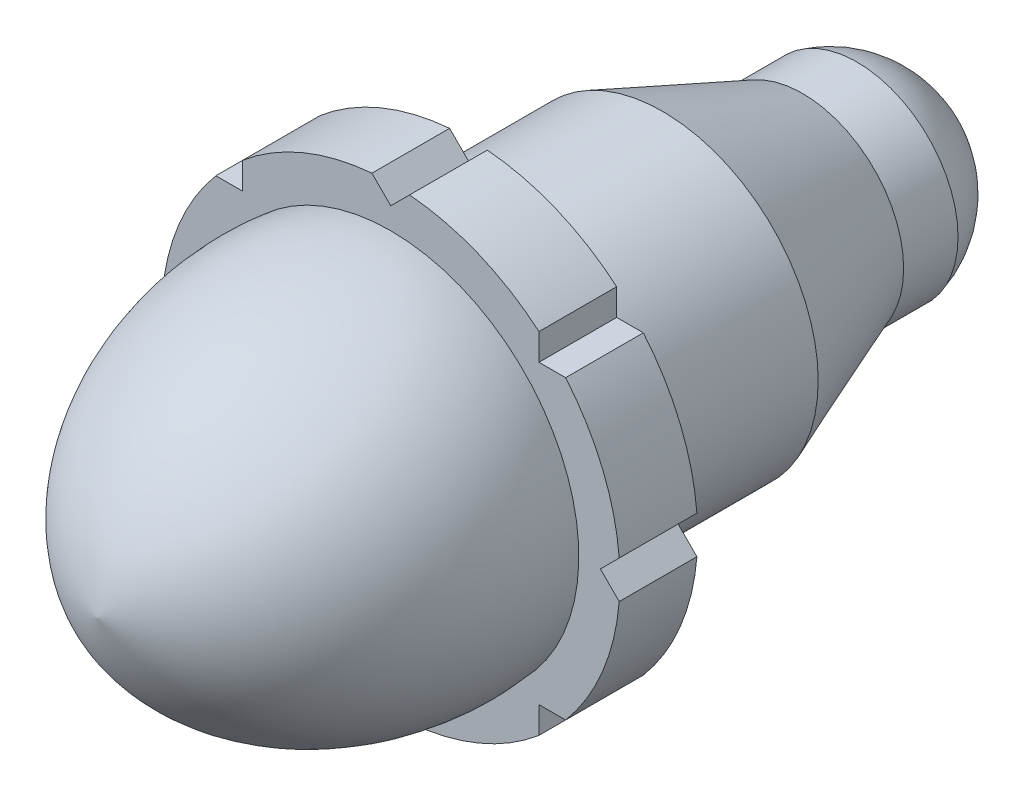
ISO-10303-21;
HEADER;
FILE_DESCRIPTION(('STEP AP214'),'2;1');
FILE_NAME('part.step','',(''),(''),'','','');
FILE_SCHEMA(('AUTOMOTIVE_DESIGN { 1 0 10303 214 1 1 1 1 }'));
ENDSEC;
DATA;
#1=APPLICATION_CONTEXT('core data for automotive mechanical design processes');
#2=APPLICATION_PROTOCOL_DEFINITION('international standard','automotive_design',2000,#1);
#3=PRODUCT_CONTEXT('',#1,'mechanical');
#4=PRODUCT('Part','Part','',(#3));
#5=PRODUCT_RELATED_PRODUCT_CATEGORY('part','',(#4));
#6=PRODUCT_DEFINITION_FORMATION('','',#4);
#7=PRODUCT_DEFINITION_CONTEXT('part definition',#1,'design');
#8=PRODUCT_DEFINITION('design','',#6,#7);
#9=PRODUCT_DEFINITION_SHAPE('','',#8);
#10=(LENGTH_UNIT() NAMED_UNIT(*) SI_UNIT(.MILLI.,.METRE.));
#11=(NAMED_UNIT(*) PLANE_ANGLE_UNIT() SI_UNIT($,.RADIAN.));
#12=(NAMED_UNIT(*) SI_UNIT($,.STERADIAN.) SOLID_ANGLE_UNIT());
#13=UNCERTAINTY_MEASURE_WITH_UNIT(LENGTH_MEASURE(1.E-05),#10,'distance_accuracy_value','');
#14=(GEOMETRIC_REPRESENTATION_CONTEXT(3) GLOBAL_UNCERTAINTY_ASSIGNED_CONTEXT((#13)) GLOBAL_UNIT_ASSIGNED_CONTEXT((#10,
#11,#12)) REPRESENTATION_CONTEXT('',''));
#15=CARTESIAN_POINT('',(0.,0.,0.));
#16=DIRECTION('',(0.,0.,1.));
#17=DIRECTION('',(1.,0.,0.));
#18=AXIS2_PLACEMENT_3D('',#15,#16,#17);
#19=CARTESIAN_POINT('',(0.,0.,7.65246356793072));
#20=DIRECTION('',(0.,0.,1.));
#21=DIRECTION('',(1.,0.,0.));
#22=AXIS2_PLACEMENT_3D('',#19,#20,#21);
#23=CYLINDRICAL_SURFACE('',#22,7.493);
#24=CARTESIAN_POINT('',(0.,0.,10.6555800844823));
#25=DIRECTION('',(0.,0.,1.));
#26=DIRECTION('',(1.,0.,0.));
#27=AXIS2_PLACEMENT_3D('',#24,#25,#26);
#28=CIRCLE('',#27,7.493);
#29=CARTESIAN_POINT('',(7.46766154888369,0.615694722507866,10.6555800844823));
#30=VERTEX_POINT('',#29);
#31=CARTESIAN_POINT('',(5.7157960342478,4.84507220739558,10.6555800844823));
#32=VERTEX_POINT('',#31);
#33=EDGE_CURVE('E404',#30,#32,#28,.T.);
#34=ORIENTED_EDGE('',*,*,#33,.F.);
#35=DIRECTION('',(0.,0.,1.));
#36=VECTOR('',#35,1.);
#37=CARTESIAN_POINT('',(7.46766154888369,0.615694722507866,-7.12441991551767));
#38=LINE('',#37,#36);
#39=CARTESIAN_POINT('',(7.46766154888369,0.615694722507866,8.11558008448232));
#40=VERTEX_POINT('',#39);
#41=EDGE_CURVE('E261',#40,#30,#38,.T.);
#42=ORIENTED_EDGE('',*,*,#41,.F.);
#43=CARTESIAN_POINT('',(0.,0.,8.11558008448233));
#44=DIRECTION('',(0.,0.,1.));
#45=DIRECTION('',(1.,0.,0.));
#46=AXIS2_PLACEMENT_3D('',#43,#44,#45);
#47=CIRCLE('',#46,7.493);
#48=CARTESIAN_POINT('',(5.7157960342478,4.84507220739558,8.11558008448233));
#49=VERTEX_POINT('',#48);
#50=EDGE_CURVE('E438',#40,#49,#47,.T.);
#51=ORIENTED_EDGE('',*,*,#50,.T.);
#52=DIRECTION('',(0.,0.,1.));
#53=VECTOR('',#52,1.);
#54=CARTESIAN_POINT('',(5.7157960342478,4.84507220739558,-7.12441991551767));
#55=LINE('',#54,#53);
#56=EDGE_CURVE('E50',#49,#32,#55,.T.);
#57=ORIENTED_EDGE('',*,*,#56,.T.);
#58=EDGE_LOOP('',(#34,#42,#51,#57));
#59=FACE_BOUND('',#58,.T.);
#60=ADVANCED_FACE('F35',(#59),#23,.T.);
#61=CARTESIAN_POINT('',(5.71579603424777,-4.84507220739562,8.11558008448232));
#62=VERTEX_POINT('',#61);
#63=CARTESIAN_POINT('',(7.46766154888368,-0.615694722507918,8.11558008448233));
#64=VERTEX_POINT('',#63);
#65=EDGE_CURVE('E440',#62,#64,#47,.T.);
#66=ORIENTED_EDGE('',*,*,#65,.T.);
#67=DIRECTION('',(0.,0.,1.));
#68=VECTOR('',#67,1.);
#69=CARTESIAN_POINT('',(7.46766154888369,-0.615694722507918,-7.12441991551767));
#70=LINE('',#69,#68);
#71=CARTESIAN_POINT('',(7.46766154888369,-0.615694722507918,10.6555800844823));
#72=VERTEX_POINT('',#71);
#73=EDGE_CURVE('E58',#64,#72,#70,.T.);
#74=ORIENTED_EDGE('',*,*,#73,.T.);
#75=CARTESIAN_POINT('',(5.71579603424777,-4.84507220739562,10.6555800844823));
#76=VERTEX_POINT('',#75);
#77=EDGE_CURVE('E409',#76,#72,#28,.T.);
#78=ORIENTED_EDGE('',*,*,#77,.F.);
#79=DIRECTION('',(0.,0.,1.));
#80=VECTOR('',#79,1.);
#81=CARTESIAN_POINT('',(5.71579603424777,-4.84507220739562,-7.12441991551767));
#82=LINE('',#81,#80);
#83=EDGE_CURVE('E281',#62,#76,#82,.T.);
#84=ORIENTED_EDGE('',*,*,#83,.F.);
#85=EDGE_LOOP('',(#66,#74,#78,#84));
#86=FACE_BOUND('',#85,.T.);
#87=ADVANCED_FACE('F394',(#86),#23,.T.);
#88=CARTESIAN_POINT('',(0.615694722507892,-7.46766154888369,8.11558008448232));
#89=VERTEX_POINT('',#88);
#90=CARTESIAN_POINT('',(4.84507220739556,-5.71579603424782,8.11558008448233));
#91=VERTEX_POINT('',#90);
#92=EDGE_CURVE('E454',#89,#91,#47,.T.);
#93=ORIENTED_EDGE('',*,*,#92,.T.);
#94=DIRECTION('',(0.,0.,1.));
#95=VECTOR('',#94,1.);
#96=CARTESIAN_POINT('',(4.84507220739556,-5.71579603424782,-7.12441991551767));
#97=LINE('',#96,#95);
#98=CARTESIAN_POINT('',(4.84507220739556,-5.71579603424782,10.6555800844823));
#99=VERTEX_POINT('',#98);
#100=EDGE_CURVE('E275',#91,#99,#97,.T.);
#101=ORIENTED_EDGE('',*,*,#100,.T.);
#102=CARTESIAN_POINT('',(0.615694722507892,-7.46766154888369,10.6555800844823));
#103=VERTEX_POINT('',#102);
#104=EDGE_CURVE('E413',#103,#99,#28,.T.);
#105=ORIENTED_EDGE('',*,*,#104,.F.);
#106=DIRECTION('',(0.,0.,1.));
#107=VECTOR('',#106,1.);
#108=CARTESIAN_POINT('',(0.615694722507892,-7.46766154888369,-7.12441991551767));
#109=LINE('',#108,#107);
#110=EDGE_CURVE('E299',#89,#103,#109,.T.);
#111=ORIENTED_EDGE('',*,*,#110,.F.);
#112=EDGE_LOOP('',(#93,#101,#105,#111));
#113=FACE_BOUND('',#112,.T.);
#114=ADVANCED_FACE('F399',(#113),#23,.T.);
#115=CARTESIAN_POINT('',(-4.84507220739564,-5.71579603424775,8.11558008448232));
#116=VERTEX_POINT('',#115);
#117=CARTESIAN_POINT('',(-0.615694722507892,-7.46766154888369,8.11558008448233));
#118=VERTEX_POINT('',#117);
#119=EDGE_CURVE('E450',#116,#118,#47,.T.);
#120=ORIENTED_EDGE('',*,*,#119,.T.);
#121=DIRECTION('',(0.,0.,1.));
#122=VECTOR('',#121,1.);
#123=CARTESIAN_POINT('',(-0.615694722507892,-7.46766154888369,-7.12441991551767));
#124=LINE('',#123,#122);
#125=CARTESIAN_POINT('',(-0.615694722507892,-7.46766154888369,10.6555800844823));
#126=VERTEX_POINT('',#125);
#127=EDGE_CURVE('E293',#118,#126,#124,.T.);
#128=ORIENTED_EDGE('',*,*,#127,.T.);
#129=CARTESIAN_POINT('',(-4.84507220739564,-5.71579603424775,10.6555800844823));
#130=VERTEX_POINT('',#129);
#131=EDGE_CURVE('E482',#130,#126,#28,.T.);
#132=ORIENTED_EDGE('',*,*,#131,.F.);
#133=DIRECTION('',(0.,0.,1.));
#134=VECTOR('',#133,1.);
#135=CARTESIAN_POINT('',(-4.84507220739564,-5.71579603424775,-7.12441991551767));
#136=LINE('',#135,#134);
#137=EDGE_CURVE('E315',#116,#130,#136,.T.);
#138=ORIENTED_EDGE('',*,*,#137,.F.);
#139=EDGE_LOOP('',(#120,#128,#132,#138));
#140=FACE_BOUND('',#139,.T.);
#141=ADVANCED_FACE('F495',(#140),#23,.T.);
#142=CARTESIAN_POINT('',(-7.46766154888369,-0.615694722507814,8.11558008448232));
#143=VERTEX_POINT('',#142);
#144=CARTESIAN_POINT('',(-5.71579603424783,-4.84507220739554,8.11558008448233));
#145=VERTEX_POINT('',#144);
#146=EDGE_CURVE('E445',#143,#145,#47,.T.);
#147=ORIENTED_EDGE('',*,*,#146,.T.);
#148=DIRECTION('',(0.,0.,1.));
#149=VECTOR('',#148,1.);
#150=CARTESIAN_POINT('',(-5.71579603424783,-4.84507220739554,-7.12441991551767));
#151=LINE('',#150,#149);
#152=CARTESIAN_POINT('',(-5.71579603424783,-4.84507220739554,10.6555800844823));
#153=VERTEX_POINT('',#152);
#154=EDGE_CURVE('E309',#145,#153,#151,.T.);
#155=ORIENTED_EDGE('',*,*,#154,.T.);
#156=CARTESIAN_POINT('',(-7.46766154888369,-0.615694722507814,10.6555800844823));
#157=VERTEX_POINT('',#156);
#158=EDGE_CURVE('E484',#157,#153,#28,.T.);
#159=ORIENTED_EDGE('',*,*,#158,.F.);
#160=DIRECTION('',(0.,0.,1.));
#161=VECTOR('',#160,1.);
#162=CARTESIAN_POINT('',(-7.46766154888369,-0.615694722507814,-7.12441991551767));
#163=LINE('',#162,#161);
#164=EDGE_CURVE('E216',#143,#157,#163,.T.);
#165=ORIENTED_EDGE('',*,*,#164,.F.);
#166=EDGE_LOOP('',(#147,#155,#159,#165));
#167=FACE_BOUND('',#166,.T.);
#168=ADVANCED_FACE('F489',(#167),#23,.T.);
#169=CARTESIAN_POINT('',(-5.71579603424773,4.84507220739566,8.11558008448232));
#170=VERTEX_POINT('',#169);
#171=CARTESIAN_POINT('',(-7.46766154888368,0.61569472250797,8.11558008448233));
#172=VERTEX_POINT('',#171);
#173=EDGE_CURVE('E443',#170,#172,#47,.T.);
#174=ORIENTED_EDGE('',*,*,#173,.T.);
#175=DIRECTION('',(0.,0.,1.));
#176=VECTOR('',#175,1.);
#177=CARTESIAN_POINT('',(-7.46766154888368,0.61569472250797,-7.12441991551767));
#178=LINE('',#177,#176);
#179=CARTESIAN_POINT('',(-7.46766154888368,0.61569472250797,10.6555800844823));
#180=VERTEX_POINT('',#179);
#181=EDGE_CURVE('E210',#172,#180,#178,.T.);
#182=ORIENTED_EDGE('',*,*,#181,.T.);
#183=CARTESIAN_POINT('',(-5.71579603424773,4.84507220739566,10.6555800844823));
#184=VERTEX_POINT('',#183);
#185=EDGE_CURVE('E227',#184,#180,#28,.T.);
#186=ORIENTED_EDGE('',*,*,#185,.F.);
#187=DIRECTION('',(0.,0.,1.));
#188=VECTOR('',#187,1.);
#189=CARTESIAN_POINT('',(-5.71579603424773,4.84507220739566,-7.12441991551767));
#190=LINE('',#189,#188);
#191=EDGE_CURVE('E249',#170,#184,#190,.T.);
#192=ORIENTED_EDGE('',*,*,#191,.F.);
#193=EDGE_LOOP('',(#174,#182,#186,#192));
#194=FACE_BOUND('',#193,.T.);
#195=ADVANCED_FACE('F390',(#194),#23,.T.);
#196=CARTESIAN_POINT('',(4.8450722073956,5.71579603424778,10.6555800844823));
#197=VERTEX_POINT('',#196);
#198=CARTESIAN_POINT('',(0.615694722507892,7.46766154888369,10.6555800844823));
#199=VERTEX_POINT('',#198);
#200=EDGE_CURVE('E410',#197,#199,#28,.T.);
#201=ORIENTED_EDGE('',*,*,#200,.F.);
#202=DIRECTION('',(0.,0.,1.));
#203=VECTOR('',#202,1.);
#204=CARTESIAN_POINT('',(4.8450722073956,5.71579603424778,-7.12441991551767));
#205=LINE('',#204,#203);
#206=CARTESIAN_POINT('',(4.8450722073956,5.71579603424778,8.11558008448232));
#207=VERTEX_POINT('',#206);
#208=EDGE_CURVE('E328',#207,#197,#205,.T.);
#209=ORIENTED_EDGE('',*,*,#208,.F.);
#210=CARTESIAN_POINT('',(0.61569472250789,7.46766154888369,8.11558008448233));
#211=VERTEX_POINT('',#210);
#212=EDGE_CURVE('E423',#207,#211,#47,.T.);
#213=ORIENTED_EDGE('',*,*,#212,.T.);
#214=DIRECTION('',(0.,0.,1.));
#215=VECTOR('',#214,1.);
#216=CARTESIAN_POINT('',(0.615694722507892,7.46766154888369,-7.12441991551767));
#217=LINE('',#216,#215);
#218=EDGE_CURVE('E346',#211,#199,#217,.T.);
#219=ORIENTED_EDGE('',*,*,#218,.T.);
#220=EDGE_LOOP('',(#201,#209,#213,#219));
#221=FACE_BOUND('',#220,.T.);
#222=ADVANCED_FACE('F384',(#221),#23,.T.);
#223=CARTESIAN_POINT('',(0.,0.,10.6555800844823));
#224=DIRECTION('',(0.,0.,-1.));
#225=DIRECTION('',(-1.,0.,0.));
#226=AXIS2_PLACEMENT_3D('',#223,#224,#225);
#227=PLANE('',#226);
#228=CARTESIAN_POINT('',(0.,0.,10.6555800844823));
#229=DIRECTION('',(0.,0.,-1.));
#230=DIRECTION('',(-1.,0.,0.));
#231=AXIS2_PLACEMENT_3D('',#228,#229,#230);
#232=CIRCLE('',#231,6.14697590150428);
#233=CARTESIAN_POINT('',(-6.14697590150428,0.,10.6555800844823));
#234=VERTEX_POINT('',#233);
#235=EDGE_CURVE('E356',#234,#234,#232,.T.);
#236=ORIENTED_EDGE('',*,*,#235,.T.);
#237=EDGE_LOOP('',(#236));
#238=FACE_BOUND('',#237,.T.);
#239=DIRECTION('',(0.707106781186545,-0.70710678118655,0.));
#240=VECTOR('',#239,1.);
#241=CARTESIAN_POINT('',(6.8519668263758,0.,10.6555800844823));
#242=LINE('',#241,#240);
#243=CARTESIAN_POINT('',(6.8519668263758,0.,10.6555800844823));
#244=VERTEX_POINT('',#243);
#245=EDGE_CURVE('E253',#244,#72,#242,.T.);
#246=ORIENTED_EDGE('',*,*,#245,.F.);
#247=DIRECTION('',(-0.70710678118655,-0.707106781186545,0.));
#248=VECTOR('',#247,1.);
#249=CARTESIAN_POINT('',(6.8519668263758,0.,10.6555800844823));
#250=LINE('',#249,#248);
#251=EDGE_CURVE('E263',#30,#244,#250,.T.);
#252=ORIENTED_EDGE('',*,*,#251,.F.);
#253=ORIENTED_EDGE('',*,*,#33,.T.);
#254=DIRECTION('',(1.,0.,0.));
#255=VECTOR('',#254,1.);
#256=CARTESIAN_POINT('',(4.8450722073956,4.84507220739558,10.6555800844823));
#257=LINE('',#256,#255);
#258=CARTESIAN_POINT('',(4.8450722073956,4.84507220739558,10.6555800844823));
#259=VERTEX_POINT('',#258);
#260=EDGE_CURVE('E269',#259,#32,#257,.T.);
#261=ORIENTED_EDGE('',*,*,#260,.F.);
#262=DIRECTION('',(0.,-1.,0.));
#263=VECTOR('',#262,1.);
#264=CARTESIAN_POINT('',(4.8450722073956,4.84507220739558,10.6555800844823));
#265=LINE('',#264,#263);
#266=EDGE_CURVE('E330',#197,#259,#265,.T.);
#267=ORIENTED_EDGE('',*,*,#266,.F.);
#268=ORIENTED_EDGE('',*,*,#200,.T.);
#269=DIRECTION('',(0.707106781186547,0.707106781186548,0.));
#270=VECTOR('',#269,1.);
#271=CARTESIAN_POINT('',(0.,6.8519668263758,10.6555800844823));
#272=LINE('',#271,#270);
#273=CARTESIAN_POINT('',(0.,6.8519668263758,10.6555800844823));
#274=VERTEX_POINT('',#273);
#275=EDGE_CURVE('E339',#274,#199,#272,.T.);
#276=ORIENTED_EDGE('',*,*,#275,.F.);
#277=DIRECTION('',(0.707106781186547,-0.707106781186548,0.));
#278=VECTOR('',#277,1.);
#279=CARTESIAN_POINT('',(0.,6.8519668263758,10.6555800844823));
#280=LINE('',#279,#278);
#281=CARTESIAN_POINT('',(-0.615694722507892,7.46766154888369,10.6555800844823));
#282=VERTEX_POINT('',#281);
#283=EDGE_CURVE('E336',#282,#274,#280,.T.);
#284=ORIENTED_EDGE('',*,*,#283,.F.);
#285=CARTESIAN_POINT('',(-4.84507220739552,5.71579603424785,10.6555800844823));
#286=VERTEX_POINT('',#285);
#287=EDGE_CURVE('E415',#282,#286,#28,.T.);
#288=ORIENTED_EDGE('',*,*,#287,.T.);
#289=DIRECTION('',(0.,1.,0.));
#290=VECTOR('',#289,1.);
#291=CARTESIAN_POINT('',(-4.84507220739553,4.84507220739565,10.6555800844823));
#292=LINE('',#291,#290);
#293=CARTESIAN_POINT('',(-4.84507220739553,4.84507220739565,10.6555800844823));
#294=VERTEX_POINT('',#293);
#295=EDGE_CURVE('E239',#294,#286,#292,.T.);
#296=ORIENTED_EDGE('',*,*,#295,.F.);
#297=DIRECTION('',(1.,0.,0.));
#298=VECTOR('',#297,1.);
#299=CARTESIAN_POINT('',(-4.84507220739553,4.84507220739565,10.6555800844823));
#300=LINE('',#299,#298);
#301=EDGE_CURVE('E231',#184,#294,#300,.T.);
#302=ORIENTED_EDGE('',*,*,#301,.F.);
#303=ORIENTED_EDGE('',*,*,#185,.T.);
#304=DIRECTION('',(-0.70710678118654,0.707106781186555,0.));
#305=VECTOR('',#304,1.);
#306=CARTESIAN_POINT('',(-6.8519668263758,0.,10.6555800844823));
#307=LINE('',#306,#305);
#308=CARTESIAN_POINT('',(-6.8519668263758,0.,10.6555800844823));
#309=VERTEX_POINT('',#308);
#310=EDGE_CURVE('E204',#309,#180,#307,.T.);
#311=ORIENTED_EDGE('',*,*,#310,.F.);
#312=DIRECTION('',(0.707106781186555,0.70710678118654,0.));
#313=VECTOR('',#312,1.);
#314=CARTESIAN_POINT('',(-6.8519668263758,0.,10.6555800844823));
#315=LINE('',#314,#313);
#316=EDGE_CURVE('E213',#157,#309,#315,.T.);
#317=ORIENTED_EDGE('',*,*,#316,.F.);
#318=ORIENTED_EDGE('',*,*,#158,.T.);
#319=DIRECTION('',(-1.,0.,0.));
#320=VECTOR('',#319,1.);
#321=CARTESIAN_POINT('',(-4.84507220739563,-4.84507220739555,10.6555800844823));
#322=LINE('',#321,#320);
#323=CARTESIAN_POINT('',(-4.84507220739563,-4.84507220739555,10.6555800844823));
#324=VERTEX_POINT('',#323);
#325=EDGE_CURVE('E238',#324,#153,#322,.T.);
#326=ORIENTED_EDGE('',*,*,#325,.F.);
#327=DIRECTION('',(0.,1.,0.));
#328=VECTOR('',#327,1.);
#329=CARTESIAN_POINT('',(-4.84507220739563,-4.84507220739555,10.6555800844823));
#330=LINE('',#329,#328);
#331=EDGE_CURVE('E317',#130,#324,#330,.T.);
#332=ORIENTED_EDGE('',*,*,#331,.F.);
#333=ORIENTED_EDGE('',*,*,#131,.T.);
#334=DIRECTION('',(-0.707106781186547,-0.707106781186548,0.));
#335=VECTOR('',#334,1.);
#336=CARTESIAN_POINT('',(0.,-6.8519668263758,10.6555800844823));
#337=LINE('',#336,#335);
#338=CARTESIAN_POINT('',(0.,-6.8519668263758,10.6555800844823));
#339=VERTEX_POINT('',#338);
#340=EDGE_CURVE('E288',#339,#126,#337,.T.);
#341=ORIENTED_EDGE('',*,*,#340,.F.);
#342=DIRECTION('',(-0.707106781186547,0.707106781186548,0.));
#343=VECTOR('',#342,1.);
#344=CARTESIAN_POINT('',(0.,-6.8519668263758,10.6555800844823));
#345=LINE('',#344,#343);
#346=EDGE_CURVE('E301',#103,#339,#345,.T.);
#347=ORIENTED_EDGE('',*,*,#346,.F.);
#348=ORIENTED_EDGE('',*,*,#104,.T.);
#349=DIRECTION('',(0.,-1.,0.));
#350=VECTOR('',#349,1.);
#351=CARTESIAN_POINT('',(4.84507220739557,-4.84507220739562,10.6555800844823));
#352=LINE('',#351,#350);
#353=CARTESIAN_POINT('',(4.84507220739557,-4.84507220739562,10.6555800844823));
#354=VERTEX_POINT('',#353);
#355=EDGE_CURVE('E270',#354,#99,#352,.T.);
#356=ORIENTED_EDGE('',*,*,#355,.F.);
#357=DIRECTION('',(-1.,0.,0.));
#358=VECTOR('',#357,1.);
#359=CARTESIAN_POINT('',(4.84507220739557,-4.84507220739562,10.6555800844823));
#360=LINE('',#359,#358);
#361=EDGE_CURVE('E283',#76,#354,#360,.T.);
#362=ORIENTED_EDGE('',*,*,#361,.F.);
#363=ORIENTED_EDGE('',*,*,#77,.T.);
#364=EDGE_LOOP('',(#246,#252,#253,#261,#267,#268,#276,#284,#288,#296,#302,#303,#311,#317,#318,
#326,#332,#333,#341,#347,#348,#356,#362,#363));
#365=FACE_BOUND('',#364,.T.);
#366=ADVANCED_FACE('F224',(#238,#365),#227,.F.);
#367=CARTESIAN_POINT('',(-0.615694722507892,7.46766154888369,8.11558008448232));
#368=VERTEX_POINT('',#367);
#369=CARTESIAN_POINT('',(-4.84507220739552,5.71579603424785,8.11558008448233));
#370=VERTEX_POINT('',#369);
#371=EDGE_CURVE('E414',#368,#370,#47,.T.);
#372=ORIENTED_EDGE('',*,*,#371,.T.);
#373=DIRECTION('',(0.,0.,1.));
#374=VECTOR('',#373,1.);
#375=CARTESIAN_POINT('',(-4.84507220739552,5.71579603424785,-7.12441991551767));
#376=LINE('',#375,#374);
#377=EDGE_CURVE('E243',#370,#286,#376,.T.);
#378=ORIENTED_EDGE('',*,*,#377,.T.);
#379=ORIENTED_EDGE('',*,*,#287,.F.);
#380=DIRECTION('',(0.,0.,1.));
#381=VECTOR('',#380,1.);
#382=CARTESIAN_POINT('',(-0.615694722507892,7.46766154888369,-7.12441991551767));
#383=LINE('',#382,#381);
#384=EDGE_CURVE('E343',#368,#282,#383,.T.);
#385=ORIENTED_EDGE('',*,*,#384,.F.);
#386=EDGE_LOOP('',(#372,#378,#379,#385));
#387=FACE_BOUND('',#386,.T.);
#388=ADVANCED_FACE('F380',(#387),#23,.T.);
#389=CARTESIAN_POINT('',(0.,5.08,8.11558008448233));
#390=DIRECTION('',(0.,0.,1.));
#391=DIRECTION('',(1.,0.,0.));
#392=AXIS2_PLACEMENT_3D('',#389,#390,#391);
#393=PLANE('',#392);
#394=ORIENTED_EDGE('',*,*,#50,.F.);
#395=DIRECTION('',(-0.70710678118655,-0.707106781186545,0.));
#396=VECTOR('',#395,1.);
#397=CARTESIAN_POINT('',(5.96598341318789,-0.885983413187918,8.11558008448233));
#398=LINE('',#397,#396);
#399=CARTESIAN_POINT('',(6.8519668263758,0.,8.11558008448232));
#400=VERTEX_POINT('',#399);
#401=EDGE_CURVE('E266',#40,#400,#398,.T.);
#402=ORIENTED_EDGE('',*,*,#401,.T.);
#403=DIRECTION('',(0.707106781186545,-0.70710678118655,0.));
#404=VECTOR('',#403,1.);
#405=CARTESIAN_POINT('',(5.9659834131879,0.885983413187877,8.11558008448233));
#406=LINE('',#405,#404);
#407=EDGE_CURVE('E259',#400,#64,#406,.T.);
#408=ORIENTED_EDGE('',*,*,#407,.T.);
#409=ORIENTED_EDGE('',*,*,#65,.F.);
#410=DIRECTION('',(-1.,0.,0.));
#411=VECTOR('',#410,1.);
#412=CARTESIAN_POINT('',(3.59210244842764,-4.84507220739561,8.11558008448233));
#413=LINE('',#412,#411);
#414=CARTESIAN_POINT('',(4.84507220739557,-4.84507220739562,8.11558008448232));
#415=VERTEX_POINT('',#414);
#416=EDGE_CURVE('E256',#62,#415,#413,.T.);
#417=ORIENTED_EDGE('',*,*,#416,.T.);
#418=DIRECTION('',(0.,-1.,0.));
#419=VECTOR('',#418,1.);
#420=CARTESIAN_POINT('',(4.84507220739557,-3.59210244842769,8.11558008448233));
#421=LINE('',#420,#419);
#422=EDGE_CURVE('E278',#415,#91,#421,.T.);
#423=ORIENTED_EDGE('',*,*,#422,.T.);
#424=ORIENTED_EDGE('',*,*,#92,.F.);
#425=DIRECTION('',(-0.707106781186547,0.707106781186548,0.));
#426=VECTOR('',#425,1.);
#427=CARTESIAN_POINT('',(-0.885983413187897,-5.9659834131879,8.11558008448233));
#428=LINE('',#427,#426);
#429=CARTESIAN_POINT('',(0.,-6.8519668263758,8.11558008448232));
#430=VERTEX_POINT('',#429);
#431=EDGE_CURVE('E273',#89,#430,#428,.T.);
#432=ORIENTED_EDGE('',*,*,#431,.T.);
#433=DIRECTION('',(-0.707106781186547,-0.707106781186548,0.));
#434=VECTOR('',#433,1.);
#435=CARTESIAN_POINT('',(0.885983413187897,-5.9659834131879,8.11558008448233));
#436=LINE('',#435,#434);
#437=EDGE_CURVE('E296',#430,#118,#436,.T.);
#438=ORIENTED_EDGE('',*,*,#437,.T.);
#439=ORIENTED_EDGE('',*,*,#119,.F.);
#440=DIRECTION('',(0.,1.,0.));
#441=VECTOR('',#440,1.);
#442=CARTESIAN_POINT('',(-4.84507220739562,-3.59210244842762,8.11558008448233));
#443=LINE('',#442,#441);
#444=CARTESIAN_POINT('',(-4.84507220739563,-4.84507220739555,8.11558008448232));
#445=VERTEX_POINT('',#444);
#446=EDGE_CURVE('E291',#116,#445,#443,.T.);
#447=ORIENTED_EDGE('',*,*,#446,.T.);
#448=DIRECTION('',(-1.,0.,0.));
#449=VECTOR('',#448,1.);
#450=CARTESIAN_POINT('',(-3.5921024484277,-4.84507220739556,8.11558008448233));
#451=LINE('',#450,#449);
#452=EDGE_CURVE('E312',#445,#145,#451,.T.);
#453=ORIENTED_EDGE('',*,*,#452,.T.);
#454=ORIENTED_EDGE('',*,*,#146,.F.);
#455=DIRECTION('',(0.707106781186555,0.70710678118654,0.));
#456=VECTOR('',#455,1.);
#457=CARTESIAN_POINT('',(-5.96598341318789,0.88598341318796,8.11558008448233));
#458=LINE('',#457,#456);
#459=CARTESIAN_POINT('',(-6.8519668263758,0.,8.11558008448232));
#460=VERTEX_POINT('',#459);
#461=EDGE_CURVE('E220',#143,#460,#458,.T.);
#462=ORIENTED_EDGE('',*,*,#461,.T.);
#463=DIRECTION('',(-0.70710678118654,0.707106781186555,0.));
#464=VECTOR('',#463,1.);
#465=CARTESIAN_POINT('',(-5.96598341318791,-0.885983413187835,8.11558008448233));
#466=LINE('',#465,#464);
#467=EDGE_CURVE('E207',#460,#172,#466,.T.);
#468=ORIENTED_EDGE('',*,*,#467,.T.);
#469=ORIENTED_EDGE('',*,*,#173,.F.);
#470=DIRECTION('',(1.,0.,0.));
#471=VECTOR('',#470,1.);
#472=CARTESIAN_POINT('',(-3.5921024484276,4.84507220739564,8.11558008448233));
#473=LINE('',#472,#471);
#474=CARTESIAN_POINT('',(-4.84507220739553,4.84507220739565,8.11558008448232));
#475=VERTEX_POINT('',#474);
#476=EDGE_CURVE('E228',#170,#475,#473,.T.);
#477=ORIENTED_EDGE('',*,*,#476,.T.);
#478=DIRECTION('',(0.,1.,0.));
#479=VECTOR('',#478,1.);
#480=CARTESIAN_POINT('',(-4.84507220739555,3.59210244842772,8.11558008448233));
#481=LINE('',#480,#479);
#482=EDGE_CURVE('E246',#475,#370,#481,.T.);
#483=ORIENTED_EDGE('',*,*,#482,.T.);
#484=ORIENTED_EDGE('',*,*,#371,.F.);
#485=DIRECTION('',(0.707106781186547,-0.707106781186548,0.));
#486=VECTOR('',#485,1.);
#487=CARTESIAN_POINT('',(0.885983413187897,5.9659834131879,8.11558008448233));
#488=LINE('',#487,#486);
#489=CARTESIAN_POINT('',(0.,6.8519668263758,8.11558008448232));
#490=VERTEX_POINT('',#489);
#491=EDGE_CURVE('E11',#368,#490,#488,.T.);
#492=ORIENTED_EDGE('',*,*,#491,.T.);
#493=DIRECTION('',(0.707106781186547,0.707106781186548,0.));
#494=VECTOR('',#493,1.);
#495=CARTESIAN_POINT('',(-0.885983413187897,5.9659834131879,8.11558008448233));
#496=LINE('',#495,#494);
#497=EDGE_CURVE('E43',#490,#211,#496,.T.);
#498=ORIENTED_EDGE('',*,*,#497,.T.);
#499=ORIENTED_EDGE('',*,*,#212,.F.);
#500=DIRECTION('',(0.,-1.,0.));
#501=VECTOR('',#500,1.);
#502=CARTESIAN_POINT('',(4.8450722073956,3.59210244842765,8.11558008448233));
#503=LINE('',#502,#501);
#504=CARTESIAN_POINT('',(4.8450722073956,4.84507220739558,8.11558008448232));
#505=VERTEX_POINT('',#504);
#506=EDGE_CURVE('E333',#207,#505,#503,.T.);
#507=ORIENTED_EDGE('',*,*,#506,.T.);
#508=DIRECTION('',(1.,0.,0.));
#509=VECTOR('',#508,1.);
#510=CARTESIAN_POINT('',(3.59210244842767,4.84507220739559,8.11558008448233));
#511=LINE('',#510,#509);
#512=EDGE_CURVE('E326',#505,#49,#511,.T.);
#513=ORIENTED_EDGE('',*,*,#512,.T.);
#514=EDGE_LOOP('',(#394,#402,#408,#409,#417,#423,#424,#432,#438,#439,#447,#453,#454,#462,#468,
#469,#477,#483,#484,#492,#498,#499,#507,#513));
#515=FACE_BOUND('',#514,.T.);
#516=CARTESIAN_POINT('',(0.,0.,8.11558008448233));
#517=DIRECTION('',(0.,0.,1.));
#518=DIRECTION('',(1.,0.,0.));
#519=AXIS2_PLACEMENT_3D('',#516,#517,#518);
#520=CIRCLE('',#519,5.08);
#521=CARTESIAN_POINT('',(5.08,0.,8.11558008448233));
#522=VERTEX_POINT('',#521);
#523=EDGE_CURVE('E439',#522,#522,#520,.T.);
#524=ORIENTED_EDGE('',*,*,#523,.T.);
#525=EDGE_LOOP('',(#524));
#526=FACE_BOUND('',#525,.T.);
#527=ADVANCED_FACE('F376',(#515,#526),#393,.F.);
#528=CARTESIAN_POINT('',(0.,0.,7.65246356793072));
#529=DIRECTION('',(0.,0.,1.));
#530=DIRECTION('',(1.,0.,0.));
#531=AXIS2_PLACEMENT_3D('',#528,#529,#530);
#532=CYLINDRICAL_SURFACE('',#531,5.08);
#533=CARTESIAN_POINT('',(0.,0.,1.76558008448233));
#534=DIRECTION('',(0.,0.,1.));
#535=DIRECTION('',(1.,0.,0.));
#536=AXIS2_PLACEMENT_3D('',#533,#534,#535);
#537=CIRCLE('',#536,5.08);
#538=CARTESIAN_POINT('',(5.08,0.,1.76558008448233));
#539=VERTEX_POINT('',#538);
#540=EDGE_CURVE('E350',#539,#539,#537,.T.);
#541=ORIENTED_EDGE('',*,*,#540,.T.);
#542=EDGE_LOOP('',(#541));
#543=FACE_BOUND('',#542,.T.);
#544=ORIENTED_EDGE('',*,*,#523,.F.);
#545=EDGE_LOOP('',(#544));
#546=FACE_BOUND('',#545,.T.);
#547=ADVANCED_FACE('F371',(#543,#546),#532,.T.);
#548=CARTESIAN_POINT('',(0.,6.14697590150428,10.6555800844823));
#549=CARTESIAN_POINT('',(0.,6.62684204601547,14.6960945852193));
#550=CARTESIAN_POINT('',(0.,4.38968593814632,19.3876758359116));
#551=CARTESIAN_POINT('',(0.,0.,20.2576375369874));
#552=B_SPLINE_CURVE_WITH_KNOTS('',3,(#548,#549,#550,#551),.UNSPECIFIED.,.F.,.F.,(4,4),(0.,1.),.UNSPECIFIED.);
#553=CARTESIAN_POINT('',(0.,0.,-4.58441991551767));
#554=DIRECTION('',(0.,0.,-1.));
#555=AXIS1_PLACEMENT('',#553,#554);
#556=SURFACE_OF_REVOLUTION('',#552,#555);
#557=CARTESIAN_POINT('',(0.,0.,20.2576375369874));
#558=VERTEX_POINT('',#557);
#559=VERTEX_LOOP('',#558);
#560=FACE_BOUND('',#559,.T.);
#561=ORIENTED_EDGE('',*,*,#235,.F.);
#562=EDGE_LOOP('',(#561));
#563=FACE_BOUND('',#562,.T.);
#564=ADVANCED_FACE('F366',(#560,#563),#556,.F.);
#565=CARTESIAN_POINT('',(0.,0.,26.6324507138416));
#566=DIRECTION('',(0.,0.,1.));
#567=DIRECTION('',(1.,0.,0.));
#568=AXIS2_PLACEMENT_3D('',#565,#566,#567);
#569=CYLINDRICAL_SURFACE('',#568,3.302);
#570=CARTESIAN_POINT('',(0.,0.,-4.58441991551767));
#571=DIRECTION('',(0.,0.,1.));
#572=DIRECTION('',(1.,0.,0.));
#573=AXIS2_PLACEMENT_3D('',#570,#571,#572);
#574=CIRCLE('',#573,3.302);
#575=CARTESIAN_POINT('',(3.302,0.,-4.58441991551767));
#576=VERTEX_POINT('',#575);
#577=EDGE_CURVE('E345',#576,#576,#574,.T.);
#578=ORIENTED_EDGE('',*,*,#577,.T.);
#579=EDGE_LOOP('',(#578));
#580=FACE_BOUND('',#579,.T.);
#581=CARTESIAN_POINT('',(0.,0.,-2.80641991551767));
#582=DIRECTION('',(0.,0.,1.));
#583=DIRECTION('',(1.,0.,0.));
#584=AXIS2_PLACEMENT_3D('',#581,#582,#583);
#585=CIRCLE('',#584,3.302);
#586=CARTESIAN_POINT('',(3.302,0.,-2.80641991551767));
#587=VERTEX_POINT('',#586);
#588=EDGE_CURVE('E353',#587,#587,#585,.T.);
#589=ORIENTED_EDGE('',*,*,#588,.F.);
#590=EDGE_LOOP('',(#589));
#591=FACE_BOUND('',#590,.T.);
#592=ADVANCED_FACE('F370',(#580,#591),#569,.T.);
#593=CARTESIAN_POINT('',(0.,0.,1.76558008448233));
#594=DIRECTION('',(0.,0.,1.));
#595=DIRECTION('',(1.,0.,0.));
#596=AXIS2_PLACEMENT_3D('',#593,#594,#595);
#597=CONICAL_SURFACE('',#596,5.08,0.370891288812663);
#598=ORIENTED_EDGE('',*,*,#588,.T.);
#599=EDGE_LOOP('',(#598));
#600=FACE_BOUND('',#599,.T.);
#601=ORIENTED_EDGE('',*,*,#540,.F.);
#602=EDGE_LOOP('',(#601));
#603=FACE_BOUND('',#602,.T.);
#604=ADVANCED_FACE('F523',(#600,#603),#597,.T.);
#605=CARTESIAN_POINT('',(0.,0.,-3.70811991551767));
#606=DIRECTION('',(0.,0.,1.));
#607=DIRECTION('',(1.,0.,0.));
#608=AXIS2_PLACEMENT_3D('',#605,#606,#607);
#609=SPHERICAL_SURFACE('',#608,3.4163);
#610=ORIENTED_EDGE('',*,*,#577,.F.);
#611=EDGE_LOOP('',(#610));
#612=FACE_BOUND('',#611,.T.);
#613=ADVANCED_FACE('F37',(#612),#609,.T.);
#614=CARTESIAN_POINT('',(0.,6.8519668263758,-7.12441991551767));
#615=DIRECTION('',(-0.707106781186548,-0.707106781186547,0.));
#616=DIRECTION('',(0.707106781186547,-0.707106781186548,0.));
#617=AXIS2_PLACEMENT_3D('',#614,#615,#616);
#618=PLANE('',#617);
#619=ORIENTED_EDGE('',*,*,#384,.T.);
#620=ORIENTED_EDGE('',*,*,#283,.T.);
#621=DIRECTION('',(0.,0.,1.));
#622=VECTOR('',#621,1.);
#623=CARTESIAN_POINT('',(0.,6.8519668263758,-7.12441991551767));
#624=LINE('',#623,#622);
#625=EDGE_CURVE('E342',#490,#274,#624,.T.);
#626=ORIENTED_EDGE('',*,*,#625,.F.);
#627=ORIENTED_EDGE('',*,*,#491,.F.);
#628=EDGE_LOOP('',(#619,#620,#626,#627));
#629=FACE_BOUND('',#628,.T.);
#630=ADVANCED_FACE('F430',(#629),#618,.F.);
#631=CARTESIAN_POINT('',(0.,6.8519668263758,-7.12441991551767));
#632=DIRECTION('',(0.707106781186548,-0.707106781186547,0.));
#633=DIRECTION('',(0.707106781186547,0.707106781186548,0.));
#634=AXIS2_PLACEMENT_3D('',#631,#632,#633);
#635=PLANE('',#634);
#636=ORIENTED_EDGE('',*,*,#625,.T.);
#637=ORIENTED_EDGE('',*,*,#275,.T.);
#638=ORIENTED_EDGE('',*,*,#218,.F.);
#639=ORIENTED_EDGE('',*,*,#497,.F.);
#640=EDGE_LOOP('',(#636,#637,#638,#639));
#641=FACE_BOUND('',#640,.T.);
#642=ADVANCED_FACE('F428',(#641),#635,.F.);
#643=CARTESIAN_POINT('',(4.8450722073956,4.84507220739558,-7.12441991551767));
#644=DIRECTION('',(-1.,0.,0.));
#645=DIRECTION('',(0.,-1.,0.));
#646=AXIS2_PLACEMENT_3D('',#643,#644,#645);
#647=PLANE('',#646);
#648=ORIENTED_EDGE('',*,*,#208,.T.);
#649=ORIENTED_EDGE('',*,*,#266,.T.);
#650=DIRECTION('',(0.,0.,1.));
#651=VECTOR('',#650,1.);
#652=CARTESIAN_POINT('',(4.8450722073956,4.84507220739558,-7.12441991551767));
#653=LINE('',#652,#651);
#654=EDGE_CURVE('E323',#505,#259,#653,.T.);
#655=ORIENTED_EDGE('',*,*,#654,.F.);
#656=ORIENTED_EDGE('',*,*,#506,.F.);
#657=EDGE_LOOP('',(#648,#649,#655,#656));
#658=FACE_BOUND('',#657,.T.);
#659=ADVANCED_FACE('F516',(#658),#647,.F.);
#660=CARTESIAN_POINT('',(4.8450722073956,4.84507220739558,-7.12441991551767));
#661=DIRECTION('',(0.,-1.,0.));
#662=DIRECTION('',(1.,0.,0.));
#663=AXIS2_PLACEMENT_3D('',#660,#661,#662);
#664=PLANE('',#663);
#665=ORIENTED_EDGE('',*,*,#654,.T.);
#666=ORIENTED_EDGE('',*,*,#260,.T.);
#667=ORIENTED_EDGE('',*,*,#56,.F.);
#668=ORIENTED_EDGE('',*,*,#512,.F.);
#669=EDGE_LOOP('',(#665,#666,#667,#668));
#670=FACE_BOUND('',#669,.T.);
#671=ADVANCED_FACE('F512',(#670),#664,.F.);
#672=CARTESIAN_POINT('',(-4.84507220739553,4.84507220739565,-7.12441991551767));
#673=DIRECTION('',(0.,-1.,0.));
#674=DIRECTION('',(1.,0.,0.));
#675=AXIS2_PLACEMENT_3D('',#672,#673,#674);
#676=PLANE('',#675);
#677=ORIENTED_EDGE('',*,*,#191,.T.);
#678=ORIENTED_EDGE('',*,*,#301,.T.);
#679=DIRECTION('',(0.,0.,1.));
#680=VECTOR('',#679,1.);
#681=CARTESIAN_POINT('',(-4.84507220739553,4.84507220739565,-7.12441991551767));
#682=LINE('',#681,#680);
#683=EDGE_CURVE('E241',#475,#294,#682,.T.);
#684=ORIENTED_EDGE('',*,*,#683,.F.);
#685=ORIENTED_EDGE('',*,*,#476,.F.);
#686=EDGE_LOOP('',(#677,#678,#684,#685));
#687=FACE_BOUND('',#686,.T.);
#688=ADVANCED_FACE('F515',(#687),#676,.F.);
#689=CARTESIAN_POINT('',(-4.84507220739553,4.84507220739565,-7.12441991551767));
#690=DIRECTION('',(1.,0.,0.));
#691=DIRECTION('',(0.,1.,0.));
#692=AXIS2_PLACEMENT_3D('',#689,#690,#691);
#693=PLANE('',#692);
#694=ORIENTED_EDGE('',*,*,#683,.T.);
#695=ORIENTED_EDGE('',*,*,#295,.T.);
#696=ORIENTED_EDGE('',*,*,#377,.F.);
#697=ORIENTED_EDGE('',*,*,#482,.F.);
#698=EDGE_LOOP('',(#694,#695,#696,#697));
#699=FACE_BOUND('',#698,.T.);
#700=ADVANCED_FACE('F651',(#699),#693,.F.);
#701=CARTESIAN_POINT('',(-6.8519668263758,0.,-7.12441991551767));
#702=DIRECTION('',(0.70710678118654,-0.707106781186555,0.));
#703=DIRECTION('',(0.707106781186555,0.70710678118654,0.));
#704=AXIS2_PLACEMENT_3D('',#701,#702,#703);
#705=PLANE('',#704);
#706=ORIENTED_EDGE('',*,*,#164,.T.);
#707=ORIENTED_EDGE('',*,*,#316,.T.);
#708=DIRECTION('',(0.,0.,1.));
#709=VECTOR('',#708,1.);
#710=CARTESIAN_POINT('',(-6.8519668263758,0.,-7.12441991551767));
#711=LINE('',#710,#709);
#712=EDGE_CURVE('E200',#460,#309,#711,.T.);
#713=ORIENTED_EDGE('',*,*,#712,.F.);
#714=ORIENTED_EDGE('',*,*,#461,.F.);
#715=EDGE_LOOP('',(#706,#707,#713,#714));
#716=FACE_BOUND('',#715,.T.);
#717=ADVANCED_FACE('F214',(#716),#705,.F.);
#718=CARTESIAN_POINT('',(-6.8519668263758,0.,-7.12441991551767));
#719=DIRECTION('',(0.707106781186555,0.70710678118654,0.));
#720=DIRECTION('',(-0.70710678118654,0.707106781186555,0.));
#721=AXIS2_PLACEMENT_3D('',#718,#719,#720);
#722=PLANE('',#721);
#723=ORIENTED_EDGE('',*,*,#712,.T.);
#724=ORIENTED_EDGE('',*,*,#310,.T.);
#725=ORIENTED_EDGE('',*,*,#181,.F.);
#726=ORIENTED_EDGE('',*,*,#467,.F.);
#727=EDGE_LOOP('',(#723,#724,#725,#726));
#728=FACE_BOUND('',#727,.T.);
#729=ADVANCED_FACE('F202',(#728),#722,.F.);
#730=CARTESIAN_POINT('',(-4.84507220739563,-4.84507220739555,-7.12441991551767));
#731=DIRECTION('',(1.,0.,0.));
#732=DIRECTION('',(0.,1.,0.));
#733=AXIS2_PLACEMENT_3D('',#730,#731,#732);
#734=PLANE('',#733);
#735=ORIENTED_EDGE('',*,*,#137,.T.);
#736=ORIENTED_EDGE('',*,*,#331,.T.);
#737=DIRECTION('',(0.,0.,1.));
#738=VECTOR('',#737,1.);
#739=CARTESIAN_POINT('',(-4.84507220739563,-4.84507220739555,-7.12441991551767));
#740=LINE('',#739,#738);
#741=EDGE_CURVE('E307',#445,#324,#740,.T.);
#742=ORIENTED_EDGE('',*,*,#741,.F.);
#743=ORIENTED_EDGE('',*,*,#446,.F.);
#744=EDGE_LOOP('',(#735,#736,#742,#743));
#745=FACE_BOUND('',#744,.T.);
#746=ADVANCED_FACE('F494',(#745),#734,.F.);
#747=CARTESIAN_POINT('',(-4.84507220739563,-4.84507220739555,-7.12441991551767));
#748=DIRECTION('',(0.,1.,0.));
#749=DIRECTION('',(-1.,0.,0.));
#750=AXIS2_PLACEMENT_3D('',#747,#748,#749);
#751=PLANE('',#750);
#752=ORIENTED_EDGE('',*,*,#741,.T.);
#753=ORIENTED_EDGE('',*,*,#325,.T.);
#754=ORIENTED_EDGE('',*,*,#154,.F.);
#755=ORIENTED_EDGE('',*,*,#452,.F.);
#756=EDGE_LOOP('',(#752,#753,#754,#755));
#757=FACE_BOUND('',#756,.T.);
#758=ADVANCED_FACE('F492',(#757),#751,.F.);
#759=CARTESIAN_POINT('',(0.,-6.8519668263758,-7.12441991551767));
#760=DIRECTION('',(0.707106781186548,0.707106781186547,0.));
#761=DIRECTION('',(-0.707106781186547,0.707106781186548,0.));
#762=AXIS2_PLACEMENT_3D('',#759,#760,#761);
#763=PLANE('',#762);
#764=ORIENTED_EDGE('',*,*,#110,.T.);
#765=ORIENTED_EDGE('',*,*,#346,.T.);
#766=DIRECTION('',(0.,0.,1.));
#767=VECTOR('',#766,1.);
#768=CARTESIAN_POINT('',(0.,-6.8519668263758,-7.12441991551767));
#769=LINE('',#768,#767);
#770=EDGE_CURVE('E290',#430,#339,#769,.T.);
#771=ORIENTED_EDGE('',*,*,#770,.F.);
#772=ORIENTED_EDGE('',*,*,#431,.F.);
#773=EDGE_LOOP('',(#764,#765,#771,#772));
#774=FACE_BOUND('',#773,.T.);
#775=ADVANCED_FACE('F479',(#774),#763,.F.);
#776=CARTESIAN_POINT('',(0.,-6.8519668263758,-7.12441991551767));
#777=DIRECTION('',(-0.707106781186548,0.707106781186547,0.));
#778=DIRECTION('',(-0.707106781186547,-0.707106781186548,0.));
#779=AXIS2_PLACEMENT_3D('',#776,#777,#778);
#780=PLANE('',#779);
#781=ORIENTED_EDGE('',*,*,#770,.T.);
#782=ORIENTED_EDGE('',*,*,#340,.T.);
#783=ORIENTED_EDGE('',*,*,#127,.F.);
#784=ORIENTED_EDGE('',*,*,#437,.F.);
#785=EDGE_LOOP('',(#781,#782,#783,#784));
#786=FACE_BOUND('',#785,.T.);
#787=ADVANCED_FACE('F497',(#786),#780,.F.);
#788=CARTESIAN_POINT('',(4.84507220739557,-4.84507220739562,-7.12441991551767));
#789=DIRECTION('',(0.,1.,0.));
#790=DIRECTION('',(-1.,0.,0.));
#791=AXIS2_PLACEMENT_3D('',#788,#789,#790);
#792=PLANE('',#791);
#793=ORIENTED_EDGE('',*,*,#83,.T.);
#794=ORIENTED_EDGE('',*,*,#361,.T.);
#795=DIRECTION('',(0.,0.,1.));
#796=VECTOR('',#795,1.);
#797=CARTESIAN_POINT('',(4.84507220739557,-4.84507220739562,-7.12441991551767));
#798=LINE('',#797,#796);
#799=EDGE_CURVE('E272',#415,#354,#798,.T.);
#800=ORIENTED_EDGE('',*,*,#799,.F.);
#801=ORIENTED_EDGE('',*,*,#416,.F.);
#802=EDGE_LOOP('',(#793,#794,#800,#801));
#803=FACE_BOUND('',#802,.T.);
#804=ADVANCED_FACE('F473',(#803),#792,.F.);
#805=CARTESIAN_POINT('',(4.84507220739557,-4.84507220739562,-7.12441991551767));
#806=DIRECTION('',(-1.,0.,0.));
#807=DIRECTION('',(0.,-1.,0.));
#808=AXIS2_PLACEMENT_3D('',#805,#806,#807);
#809=PLANE('',#808);
#810=ORIENTED_EDGE('',*,*,#799,.T.);
#811=ORIENTED_EDGE('',*,*,#355,.T.);
#812=ORIENTED_EDGE('',*,*,#100,.F.);
#813=ORIENTED_EDGE('',*,*,#422,.F.);
#814=EDGE_LOOP('',(#810,#811,#812,#813));
#815=FACE_BOUND('',#814,.T.);
#816=ADVANCED_FACE('F476',(#815),#809,.F.);
#817=CARTESIAN_POINT('',(6.8519668263758,0.,-7.12441991551767));
#818=DIRECTION('',(-0.707106781186545,0.70710678118655,0.));
#819=DIRECTION('',(-0.70710678118655,-0.707106781186545,0.));
#820=AXIS2_PLACEMENT_3D('',#817,#818,#819);
#821=PLANE('',#820);
#822=ORIENTED_EDGE('',*,*,#41,.T.);
#823=ORIENTED_EDGE('',*,*,#251,.T.);
#824=DIRECTION('',(0.,0.,1.));
#825=VECTOR('',#824,1.);
#826=CARTESIAN_POINT('',(6.8519668263758,0.,-7.12441991551767));
#827=LINE('',#826,#825);
#828=EDGE_CURVE('E255',#400,#244,#827,.T.);
#829=ORIENTED_EDGE('',*,*,#828,.F.);
#830=ORIENTED_EDGE('',*,*,#401,.F.);
#831=EDGE_LOOP('',(#822,#823,#829,#830));
#832=FACE_BOUND('',#831,.T.);
#833=ADVANCED_FACE('F468',(#832),#821,.F.);
#834=CARTESIAN_POINT('',(6.8519668263758,0.,-7.12441991551767));
#835=DIRECTION('',(-0.70710678118655,-0.707106781186545,0.));
#836=DIRECTION('',(0.707106781186545,-0.70710678118655,0.));
#837=AXIS2_PLACEMENT_3D('',#834,#835,#836);
#838=PLANE('',#837);
#839=ORIENTED_EDGE('',*,*,#828,.T.);
#840=ORIENTED_EDGE('',*,*,#245,.T.);
#841=ORIENTED_EDGE('',*,*,#73,.F.);
#842=ORIENTED_EDGE('',*,*,#407,.F.);
#843=EDGE_LOOP('',(#839,#840,#841,#842));
#844=FACE_BOUND('',#843,.T.);
#845=ADVANCED_FACE('F466',(#844),#838,.F.);
#846=CLOSED_SHELL('',(#60,#87,#114,#141,#168,#195,#222,#366,#388,#527,#547,#564,#592,#604,#613,
#630,#642,#659,#671,#688,#700,#717,#729,#746,#758,#775,#787,#804,#816,#833,#845));
#847=MANIFOLD_SOLID_BREP('B2',#846);
#848=ADVANCED_BREP_SHAPE_REPRESENTATION('',(#18,#847),#14);
#849=SHAPE_DEFINITION_REPRESENTATION(#9,#848);
ENDSEC;
END-ISO-10303-21;
